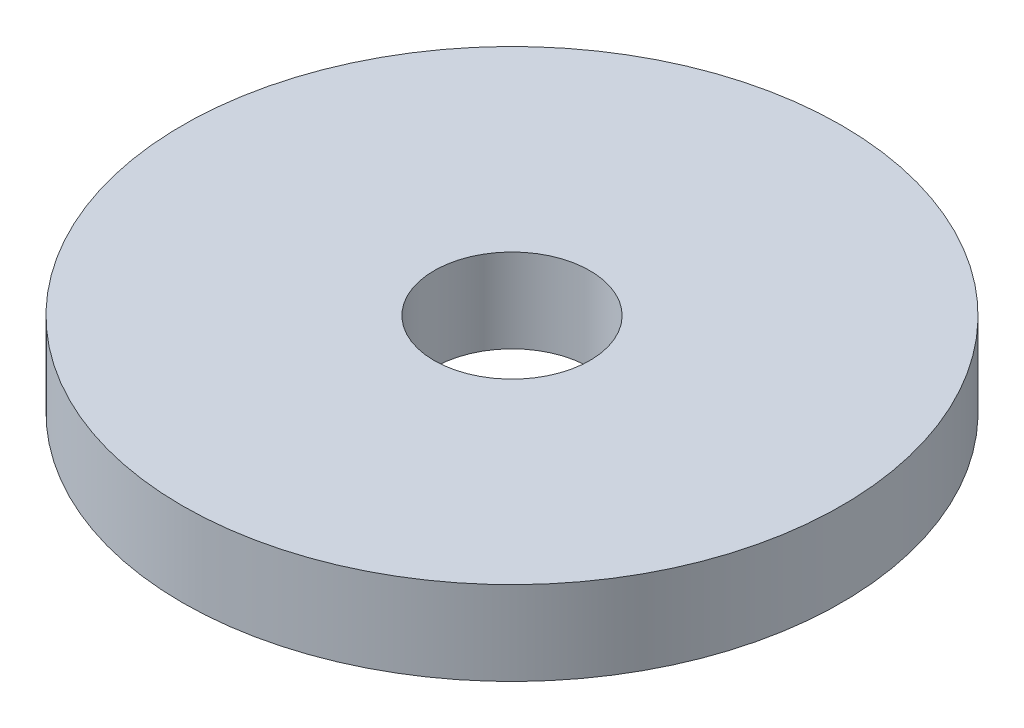
ISO-10303-21;
HEADER;
FILE_DESCRIPTION(('STEP AP214'),'2;1');
FILE_NAME('part.step','',(''),(''),'','','');
FILE_SCHEMA(('AUTOMOTIVE_DESIGN { 1 0 10303 214 1 1 1 1 }'));
ENDSEC;
DATA;
#1=APPLICATION_CONTEXT('core data for automotive mechanical design processes');
#2=APPLICATION_PROTOCOL_DEFINITION('international standard','automotive_design',2000,#1);
#3=PRODUCT_CONTEXT('',#1,'mechanical');
#4=PRODUCT('Part','Part','',(#3));
#5=PRODUCT_RELATED_PRODUCT_CATEGORY('part','',(#4));
#6=PRODUCT_DEFINITION_FORMATION('','',#4);
#7=PRODUCT_DEFINITION_CONTEXT('part definition',#1,'design');
#8=PRODUCT_DEFINITION('design','',#6,#7);
#9=PRODUCT_DEFINITION_SHAPE('','',#8);
#10=(LENGTH_UNIT() NAMED_UNIT(*) SI_UNIT(.MILLI.,.METRE.));
#11=(NAMED_UNIT(*) PLANE_ANGLE_UNIT() SI_UNIT($,.RADIAN.));
#12=(NAMED_UNIT(*) SI_UNIT($,.STERADIAN.) SOLID_ANGLE_UNIT());
#13=UNCERTAINTY_MEASURE_WITH_UNIT(LENGTH_MEASURE(1.E-05),#10,'distance_accuracy_value','');
#14=(GEOMETRIC_REPRESENTATION_CONTEXT(3) GLOBAL_UNCERTAINTY_ASSIGNED_CONTEXT((#13)) GLOBAL_UNIT_ASSIGNED_CONTEXT((#10,
#11,#12)) REPRESENTATION_CONTEXT('',''));
#15=CARTESIAN_POINT('',(0.,0.,0.));
#16=DIRECTION('',(0.,0.,1.));
#17=DIRECTION('',(1.,0.,0.));
#18=AXIS2_PLACEMENT_3D('',#15,#16,#17);
#19=CARTESIAN_POINT('',(0.,1.4,0.));
#20=DIRECTION('',(0.,-1.,0.));
#21=DIRECTION('',(0.,0.,-1.));
#22=AXIS2_PLACEMENT_3D('',#19,#20,#21);
#23=CYLINDRICAL_SURFACE('',#22,5.5);
#24=CARTESIAN_POINT('',(0.,1.4,0.));
#25=DIRECTION('',(0.,1.,0.));
#26=DIRECTION('',(0.,0.,1.));
#27=AXIS2_PLACEMENT_3D('',#24,#25,#26);
#28=CIRCLE('',#27,5.5);
#29=CARTESIAN_POINT('',(0.,1.4,5.5));
#30=VERTEX_POINT('',#29);
#31=EDGE_CURVE('E10',#30,#30,#28,.T.);
#32=ORIENTED_EDGE('',*,*,#31,.F.);
#33=EDGE_LOOP('',(#32));
#34=FACE_BOUND('',#33,.T.);
#35=CARTESIAN_POINT('',(0.,0.,0.));
#36=DIRECTION('',(0.,1.,0.));
#37=DIRECTION('',(0.,0.,1.));
#38=AXIS2_PLACEMENT_3D('',#35,#36,#37);
#39=CIRCLE('',#38,5.5);
#40=CARTESIAN_POINT('',(0.,0.,5.5));
#41=VERTEX_POINT('',#40);
#42=EDGE_CURVE('E34',#41,#41,#39,.T.);
#43=ORIENTED_EDGE('',*,*,#42,.T.);
#44=EDGE_LOOP('',(#43));
#45=FACE_BOUND('',#44,.T.);
#46=ADVANCED_FACE('F31',(#34,#45),#23,.T.);
#47=CARTESIAN_POINT('',(0.,1.4,0.));
#48=DIRECTION('',(0.,1.,0.));
#49=DIRECTION('',(0.,0.,1.));
#50=AXIS2_PLACEMENT_3D('',#47,#48,#49);
#51=PLANE('',#50);
#52=CARTESIAN_POINT('',(0.,1.4,0.));
#53=DIRECTION('',(0.,1.,0.));
#54=DIRECTION('',(0.,0.,1.));
#55=AXIS2_PLACEMENT_3D('',#52,#53,#54);
#56=CIRCLE('',#55,1.29999999999999);
#57=CARTESIAN_POINT('',(0.,1.4,1.29999999999999));
#58=VERTEX_POINT('',#57);
#59=EDGE_CURVE('E45',#58,#58,#56,.T.);
#60=ORIENTED_EDGE('',*,*,#59,.F.);
#61=EDGE_LOOP('',(#60));
#62=FACE_BOUND('',#61,.T.);
#63=ORIENTED_EDGE('',*,*,#31,.T.);
#64=EDGE_LOOP('',(#63));
#65=FACE_BOUND('',#64,.T.);
#66=ADVANCED_FACE('F52',(#62,#65),#51,.T.);
#67=CARTESIAN_POINT('',(0.,0.,0.));
#68=DIRECTION('',(0.,1.,0.));
#69=DIRECTION('',(0.,0.,1.));
#70=AXIS2_PLACEMENT_3D('',#67,#68,#69);
#71=PLANE('',#70);
#72=CARTESIAN_POINT('',(0.,0.,0.));
#73=DIRECTION('',(0.,1.,0.));
#74=DIRECTION('',(0.,0.,1.));
#75=AXIS2_PLACEMENT_3D('',#72,#73,#74);
#76=CIRCLE('',#75,1.29999999999999);
#77=CARTESIAN_POINT('',(0.,0.,1.29999999999999));
#78=VERTEX_POINT('',#77);
#79=EDGE_CURVE('E41',#78,#78,#76,.T.);
#80=ORIENTED_EDGE('',*,*,#79,.T.);
#81=EDGE_LOOP('',(#80));
#82=FACE_BOUND('',#81,.T.);
#83=ORIENTED_EDGE('',*,*,#42,.F.);
#84=EDGE_LOOP('',(#83));
#85=FACE_BOUND('',#84,.T.);
#86=ADVANCED_FACE('F54',(#82,#85),#71,.F.);
#87=CARTESIAN_POINT('',(0.,1.4,0.));
#88=DIRECTION('',(0.,1.,0.));
#89=DIRECTION('',(0.,0.,1.));
#90=AXIS2_PLACEMENT_3D('',#87,#88,#89);
#91=CYLINDRICAL_SURFACE('',#90,1.29999999999999);
#92=ORIENTED_EDGE('',*,*,#59,.T.);
#93=EDGE_LOOP('',(#92));
#94=FACE_BOUND('',#93,.T.);
#95=ORIENTED_EDGE('',*,*,#79,.F.);
#96=EDGE_LOOP('',(#95));
#97=FACE_BOUND('',#96,.T.);
#98=ADVANCED_FACE('F49',(#94,#97),#91,.F.);
#99=CLOSED_SHELL('',(#46,#66,#86,#98));
#100=MANIFOLD_SOLID_BREP('B2',#99);
#101=ADVANCED_BREP_SHAPE_REPRESENTATION('',(#18,#100),#14);
#102=SHAPE_DEFINITION_REPRESENTATION(#9,#101);
ENDSEC;
END-ISO-10303-21;
